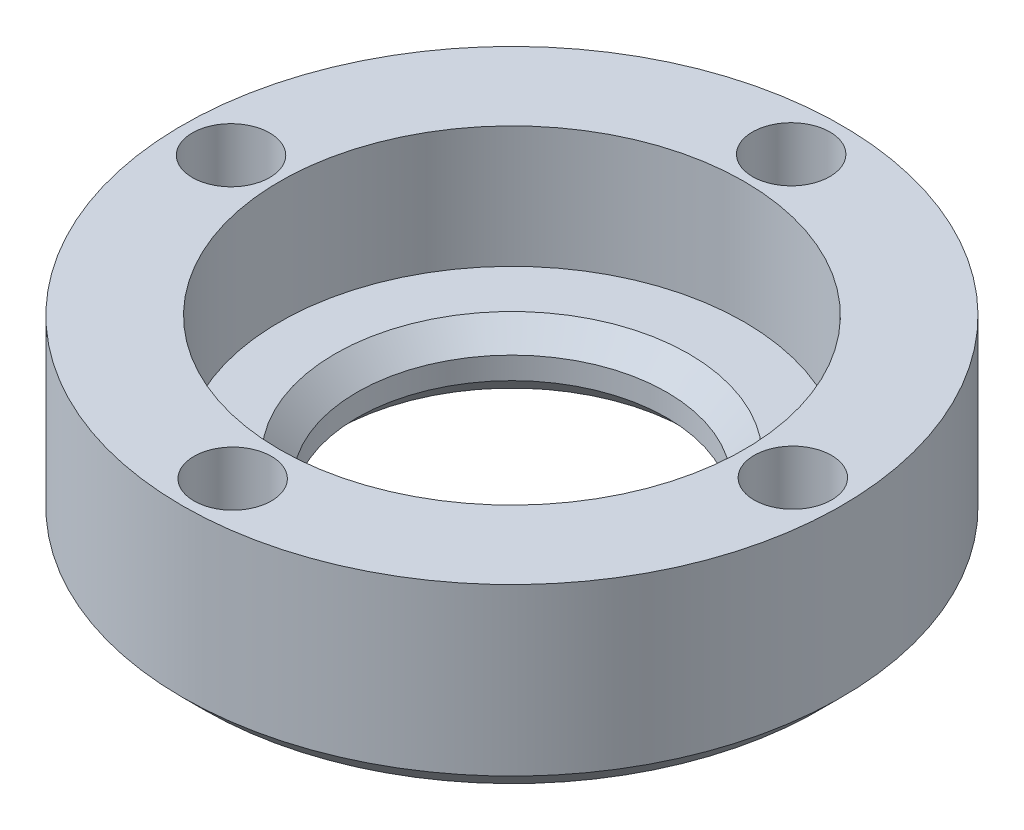
ISO-10303-21;
HEADER;
FILE_DESCRIPTION(('STEP AP214'),'2;1');
FILE_NAME('part.step','',(''),(''),'','','');
FILE_SCHEMA(('AUTOMOTIVE_DESIGN { 1 0 10303 214 1 1 1 1 }'));
ENDSEC;
DATA;
#1=APPLICATION_CONTEXT('core data for automotive mechanical design processes');
#2=APPLICATION_PROTOCOL_DEFINITION('international standard','automotive_design',2000,#1);
#3=PRODUCT_CONTEXT('',#1,'mechanical');
#4=PRODUCT('Part','Part','',(#3));
#5=PRODUCT_RELATED_PRODUCT_CATEGORY('part','',(#4));
#6=PRODUCT_DEFINITION_FORMATION('','',#4);
#7=PRODUCT_DEFINITION_CONTEXT('part definition',#1,'design');
#8=PRODUCT_DEFINITION('design','',#6,#7);
#9=PRODUCT_DEFINITION_SHAPE('','',#8);
#10=(LENGTH_UNIT() NAMED_UNIT(*) SI_UNIT(.MILLI.,.METRE.));
#11=(NAMED_UNIT(*) PLANE_ANGLE_UNIT() SI_UNIT($,.RADIAN.));
#12=(NAMED_UNIT(*) SI_UNIT($,.STERADIAN.) SOLID_ANGLE_UNIT());
#13=UNCERTAINTY_MEASURE_WITH_UNIT(LENGTH_MEASURE(1.E-05),#10,'distance_accuracy_value','');
#14=(GEOMETRIC_REPRESENTATION_CONTEXT(3) GLOBAL_UNCERTAINTY_ASSIGNED_CONTEXT((#13)) GLOBAL_UNIT_ASSIGNED_CONTEXT((#10,
#11,#12)) REPRESENTATION_CONTEXT('',''));
#15=CARTESIAN_POINT('',(0.,0.,0.));
#16=DIRECTION('',(0.,0.,1.));
#17=DIRECTION('',(1.,0.,0.));
#18=AXIS2_PLACEMENT_3D('',#15,#16,#17);
#19=CARTESIAN_POINT('',(0.,3.,0.));
#20=DIRECTION('',(0.,1.,0.));
#21=DIRECTION('',(0.,0.,1.));
#22=AXIS2_PLACEMENT_3D('',#19,#20,#21);
#23=PLANE('',#22);
#24=CARTESIAN_POINT('',(0.,3.,0.));
#25=DIRECTION('',(0.,1.,0.));
#26=DIRECTION('',(0.,0.,1.));
#27=AXIS2_PLACEMENT_3D('',#24,#25,#26);
#28=CIRCLE('',#27,8.);
#29=CARTESIAN_POINT('',(0.,3.,8.));
#30=VERTEX_POINT('',#29);
#31=EDGE_CURVE('E54',#30,#30,#28,.F.);
#32=ORIENTED_EDGE('',*,*,#31,.T.);
#33=EDGE_LOOP('',(#32));
#34=FACE_BOUND('',#33,.T.);
#35=CARTESIAN_POINT('',(0.,3.,0.));
#36=DIRECTION('',(0.,1.,0.));
#37=DIRECTION('',(0.,0.,1.));
#38=AXIS2_PLACEMENT_3D('',#35,#36,#37);
#39=CIRCLE('',#38,10.5);
#40=CARTESIAN_POINT('',(0.,3.,10.5));
#41=VERTEX_POINT('',#40);
#42=EDGE_CURVE('E69',#41,#41,#39,.T.);
#43=ORIENTED_EDGE('',*,*,#42,.T.);
#44=EDGE_LOOP('',(#43));
#45=FACE_BOUND('',#44,.T.);
#46=ADVANCED_FACE('F39',(#34,#45),#23,.T.);
#47=CARTESIAN_POINT('',(0.,3.,0.));
#48=DIRECTION('',(0.,-1.,0.));
#49=DIRECTION('',(0.,0.,-1.));
#50=AXIS2_PLACEMENT_3D('',#47,#48,#49);
#51=CYLINDRICAL_SURFACE('',#50,14.9);
#52=CARTESIAN_POINT('',(0.,1.00000000000001,0.));
#53=DIRECTION('',(0.,1.,0.));
#54=DIRECTION('',(0.,0.,1.));
#55=AXIS2_PLACEMENT_3D('',#52,#53,#54);
#56=CIRCLE('',#55,14.9);
#57=CARTESIAN_POINT('',(0.,1.00000000000001,14.9));
#58=VERTEX_POINT('',#57);
#59=EDGE_CURVE('E51',#58,#58,#56,.T.);
#60=ORIENTED_EDGE('',*,*,#59,.T.);
#61=EDGE_LOOP('',(#60));
#62=FACE_BOUND('',#61,.T.);
#63=CARTESIAN_POINT('',(0.,8.5,0.));
#64=DIRECTION('',(0.,1.,0.));
#65=DIRECTION('',(0.,0.,1.));
#66=AXIS2_PLACEMENT_3D('',#63,#64,#65);
#67=CIRCLE('',#66,14.9);
#68=CARTESIAN_POINT('',(0.,8.5,14.9));
#69=VERTEX_POINT('',#68);
#70=EDGE_CURVE('E73',#69,#69,#67,.T.);
#71=ORIENTED_EDGE('',*,*,#70,.F.);
#72=EDGE_LOOP('',(#71));
#73=FACE_BOUND('',#72,.T.);
#74=ADVANCED_FACE('F125',(#62,#73),#51,.T.);
#75=CARTESIAN_POINT('',(0.,0.,0.));
#76=DIRECTION('',(0.,1.,0.));
#77=DIRECTION('',(0.,0.,1.));
#78=AXIS2_PLACEMENT_3D('',#75,#76,#77);
#79=PLANE('',#78);
#80=CARTESIAN_POINT('',(0.,0.,0.));
#81=DIRECTION('',(0.,1.,0.));
#82=DIRECTION('',(0.,0.,1.));
#83=AXIS2_PLACEMENT_3D('',#80,#81,#82);
#84=CIRCLE('',#83,13.9);
#85=CARTESIAN_POINT('',(0.,0.,13.9));
#86=VERTEX_POINT('',#85);
#87=EDGE_CURVE('E10',#86,#86,#84,.F.);
#88=ORIENTED_EDGE('',*,*,#87,.T.);
#89=EDGE_LOOP('',(#88));
#90=FACE_BOUND('',#89,.T.);
#91=CARTESIAN_POINT('',(0.,0.,0.));
#92=DIRECTION('',(0.,1.,0.));
#93=DIRECTION('',(0.,0.,1.));
#94=AXIS2_PLACEMENT_3D('',#91,#92,#93);
#95=CIRCLE('',#94,8.);
#96=CARTESIAN_POINT('',(0.,0.,8.));
#97=VERTEX_POINT('',#96);
#98=EDGE_CURVE('E50',#97,#97,#95,.T.);
#99=ORIENTED_EDGE('',*,*,#98,.T.);
#100=EDGE_LOOP('',(#99));
#101=FACE_BOUND('',#100,.T.);
#102=ADVANCED_FACE('F126',(#90,#101),#79,.F.);
#103=CARTESIAN_POINT('',(0.,0.,0.));
#104=DIRECTION('',(0.,1.,0.));
#105=DIRECTION('',(0.,0.,1.));
#106=AXIS2_PLACEMENT_3D('',#103,#104,#105);
#107=CYLINDRICAL_SURFACE('',#106,7.);
#108=CARTESIAN_POINT('',(0.,2.00000000000001,0.));
#109=DIRECTION('',(0.,1.,0.));
#110=DIRECTION('',(0.,0.,1.));
#111=AXIS2_PLACEMENT_3D('',#108,#109,#110);
#112=CIRCLE('',#111,7.);
#113=CARTESIAN_POINT('',(0.,2.00000000000001,7.));
#114=VERTEX_POINT('',#113);
#115=EDGE_CURVE('E58',#114,#114,#112,.T.);
#116=ORIENTED_EDGE('',*,*,#115,.T.);
#117=EDGE_LOOP('',(#116));
#118=FACE_BOUND('',#117,.T.);
#119=CARTESIAN_POINT('',(0.,1.00000000000001,0.));
#120=DIRECTION('',(0.,1.,0.));
#121=DIRECTION('',(0.,0.,1.));
#122=AXIS2_PLACEMENT_3D('',#119,#120,#121);
#123=CIRCLE('',#122,7.);
#124=CARTESIAN_POINT('',(0.,1.00000000000001,7.));
#125=VERTEX_POINT('',#124);
#126=EDGE_CURVE('E64',#125,#125,#123,.F.);
#127=ORIENTED_EDGE('',*,*,#126,.T.);
#128=EDGE_LOOP('',(#127));
#129=FACE_BOUND('',#128,.T.);
#130=ADVANCED_FACE('F132',(#118,#129),#107,.F.);
#131=CARTESIAN_POINT('',(0.,6.5,0.));
#132=DIRECTION('',(0.,-1.,0.));
#133=DIRECTION('',(0.,0.,-1.));
#134=AXIS2_PLACEMENT_3D('',#131,#132,#133);
#135=CYLINDRICAL_SURFACE('',#134,10.5);
#136=ORIENTED_EDGE('',*,*,#42,.F.);
#137=EDGE_LOOP('',(#136));
#138=FACE_BOUND('',#137,.T.);
#139=CARTESIAN_POINT('',(0.,8.5,0.));
#140=DIRECTION('',(0.,1.,0.));
#141=DIRECTION('',(0.,0.,1.));
#142=AXIS2_PLACEMENT_3D('',#139,#140,#141);
#143=CIRCLE('',#142,10.5);
#144=CARTESIAN_POINT('',(0.,8.5,10.5));
#145=VERTEX_POINT('',#144);
#146=EDGE_CURVE('E81',#145,#145,#143,.T.);
#147=ORIENTED_EDGE('',*,*,#146,.T.);
#148=EDGE_LOOP('',(#147));
#149=FACE_BOUND('',#148,.T.);
#150=ADVANCED_FACE('F144',(#138,#149),#135,.F.);
#151=CARTESIAN_POINT('',(0.,2.00000000000001,0.));
#152=DIRECTION('',(0.,1.,0.));
#153=DIRECTION('',(0.,0.,1.));
#154=AXIS2_PLACEMENT_3D('',#151,#152,#153);
#155=CONICAL_SURFACE('',#154,7.,0.78539816339745);
#156=ORIENTED_EDGE('',*,*,#31,.F.);
#157=EDGE_LOOP('',(#156));
#158=FACE_BOUND('',#157,.T.);
#159=ORIENTED_EDGE('',*,*,#115,.F.);
#160=EDGE_LOOP('',(#159));
#161=FACE_BOUND('',#160,.T.);
#162=ADVANCED_FACE('F138',(#158,#161),#155,.F.);
#163=CARTESIAN_POINT('',(0.,1.00000000000001,0.));
#164=DIRECTION('',(0.,1.,0.));
#165=DIRECTION('',(0.,0.,1.));
#166=AXIS2_PLACEMENT_3D('',#163,#164,#165);
#167=CONICAL_SURFACE('',#166,14.9,0.785398163397449);
#168=ORIENTED_EDGE('',*,*,#87,.F.);
#169=EDGE_LOOP('',(#168));
#170=FACE_BOUND('',#169,.T.);
#171=ORIENTED_EDGE('',*,*,#59,.F.);
#172=EDGE_LOOP('',(#171));
#173=FACE_BOUND('',#172,.T.);
#174=ADVANCED_FACE('F116',(#170,#173),#167,.T.);
#175=CARTESIAN_POINT('',(0.,0.,0.));
#176=DIRECTION('',(0.,-1.,0.));
#177=DIRECTION('',(0.,0.,-1.));
#178=AXIS2_PLACEMENT_3D('',#175,#176,#177);
#179=CONICAL_SURFACE('',#178,8.,0.785398163397447);
#180=ORIENTED_EDGE('',*,*,#126,.F.);
#181=EDGE_LOOP('',(#180));
#182=FACE_BOUND('',#181,.T.);
#183=ORIENTED_EDGE('',*,*,#98,.F.);
#184=EDGE_LOOP('',(#183));
#185=FACE_BOUND('',#184,.T.);
#186=ADVANCED_FACE('F45',(#182,#185),#179,.F.);
#187=CARTESIAN_POINT('',(0.,8.5,0.));
#188=DIRECTION('',(0.,1.,0.));
#189=DIRECTION('',(0.,0.,1.));
#190=AXIS2_PLACEMENT_3D('',#187,#188,#189);
#191=PLANE('',#190);
#192=CARTESIAN_POINT('',(0.0750000000000005,8.5,12.6999999999999));
#193=DIRECTION('',(0.,1.,0.));
#194=DIRECTION('',(0.,0.,1.));
#195=AXIS2_PLACEMENT_3D('',#192,#193,#194);
#196=CIRCLE('',#195,1.75);
#197=CARTESIAN_POINT('',(0.0750000000000005,8.5,14.4499999999999));
#198=VERTEX_POINT('',#197);
#199=EDGE_CURVE('E95',#198,#198,#196,.T.);
#200=ORIENTED_EDGE('',*,*,#199,.F.);
#201=EDGE_LOOP('',(#200));
#202=FACE_BOUND('',#201,.T.);
#203=CARTESIAN_POINT('',(1.31918385923908E-13,8.5,-12.625));
#204=DIRECTION('',(0.,1.,0.));
#205=DIRECTION('',(0.,0.,1.));
#206=AXIS2_PLACEMENT_3D('',#203,#204,#205);
#207=CIRCLE('',#206,1.75);
#208=CARTESIAN_POINT('',(1.31918385923908E-13,8.5,-10.875));
#209=VERTEX_POINT('',#208);
#210=EDGE_CURVE('E86',#209,#209,#207,.T.);
#211=ORIENTED_EDGE('',*,*,#210,.F.);
#212=EDGE_LOOP('',(#211));
#213=FACE_BOUND('',#212,.T.);
#214=ORIENTED_EDGE('',*,*,#70,.T.);
#215=EDGE_LOOP('',(#214));
#216=FACE_BOUND('',#215,.T.);
#217=ORIENTED_EDGE('',*,*,#146,.F.);
#218=EDGE_LOOP('',(#217));
#219=FACE_BOUND('',#218,.T.);
#220=CARTESIAN_POINT('',(-12.6249999999999,8.5,0.0749999999998712));
#221=DIRECTION('',(0.,1.,0.));
#222=DIRECTION('',(0.,0.,1.));
#223=AXIS2_PLACEMENT_3D('',#220,#221,#222);
#224=CIRCLE('',#223,1.75);
#225=CARTESIAN_POINT('',(-12.6249999999999,8.5,1.82499999999987));
#226=VERTEX_POINT('',#225);
#227=EDGE_CURVE('E87',#226,#226,#224,.T.);
#228=ORIENTED_EDGE('',*,*,#227,.F.);
#229=EDGE_LOOP('',(#228));
#230=FACE_BOUND('',#229,.T.);
#231=CARTESIAN_POINT('',(12.7,8.5,0.));
#232=DIRECTION('',(0.,1.,0.));
#233=DIRECTION('',(0.,0.,1.));
#234=AXIS2_PLACEMENT_3D('',#231,#232,#233);
#235=CIRCLE('',#234,1.75);
#236=CARTESIAN_POINT('',(12.7,8.5,1.75));
#237=VERTEX_POINT('',#236);
#238=EDGE_CURVE('E98',#237,#237,#235,.T.);
#239=ORIENTED_EDGE('',*,*,#238,.F.);
#240=EDGE_LOOP('',(#239));
#241=FACE_BOUND('',#240,.T.);
#242=ADVANCED_FACE('F105',(#202,#213,#216,#219,#230,#241),#191,.T.);
#243=CARTESIAN_POINT('',(1.31918385923908E-13,2.5,-12.625));
#244=DIRECTION('',(0.,1.,0.));
#245=DIRECTION('',(0.,0.,1.));
#246=AXIS2_PLACEMENT_3D('',#243,#244,#245);
#247=PLANE('',#246);
#248=CARTESIAN_POINT('',(1.31918385923908E-13,2.5,-12.625));
#249=DIRECTION('',(0.,1.,0.));
#250=DIRECTION('',(0.,0.,1.));
#251=AXIS2_PLACEMENT_3D('',#248,#249,#250);
#252=CIRCLE('',#251,1.75);
#253=CARTESIAN_POINT('',(1.31918385923908E-13,2.5,-10.875));
#254=VERTEX_POINT('',#253);
#255=EDGE_CURVE('E67',#254,#254,#252,.T.);
#256=ORIENTED_EDGE('',*,*,#255,.T.);
#257=EDGE_LOOP('',(#256));
#258=FACE_BOUND('',#257,.T.);
#259=ADVANCED_FACE('F104',(#258),#247,.T.);
#260=CARTESIAN_POINT('',(1.31918385923908E-13,2.5,-12.625));
#261=DIRECTION('',(0.,1.,0.));
#262=DIRECTION('',(0.,0.,1.));
#263=AXIS2_PLACEMENT_3D('',#260,#261,#262);
#264=CYLINDRICAL_SURFACE('',#263,1.75);
#265=ORIENTED_EDGE('',*,*,#255,.F.);
#266=EDGE_LOOP('',(#265));
#267=FACE_BOUND('',#266,.T.);
#268=ORIENTED_EDGE('',*,*,#210,.T.);
#269=EDGE_LOOP('',(#268));
#270=FACE_BOUND('',#269,.T.);
#271=ADVANCED_FACE('F115',(#267,#270),#264,.F.);
#272=CARTESIAN_POINT('',(-12.6249999999999,2.5,0.0749999999998712));
#273=DIRECTION('',(0.,1.,0.));
#274=DIRECTION('',(0.,0.,1.));
#275=AXIS2_PLACEMENT_3D('',#272,#273,#274);
#276=PLANE('',#275);
#277=CARTESIAN_POINT('',(-12.6249999999999,2.5,0.0749999999998712));
#278=DIRECTION('',(0.,1.,0.));
#279=DIRECTION('',(0.,0.,1.));
#280=AXIS2_PLACEMENT_3D('',#277,#278,#279);
#281=CIRCLE('',#280,1.75);
#282=CARTESIAN_POINT('',(-12.6249999999999,2.5,1.82499999999987));
#283=VERTEX_POINT('',#282);
#284=EDGE_CURVE('E75',#283,#283,#281,.T.);
#285=ORIENTED_EDGE('',*,*,#284,.T.);
#286=EDGE_LOOP('',(#285));
#287=FACE_BOUND('',#286,.T.);
#288=ADVANCED_FACE('F164',(#287),#276,.T.);
#289=CARTESIAN_POINT('',(-12.6249999999999,2.5,0.0749999999998712));
#290=DIRECTION('',(0.,1.,0.));
#291=DIRECTION('',(0.,0.,1.));
#292=AXIS2_PLACEMENT_3D('',#289,#290,#291);
#293=CYLINDRICAL_SURFACE('',#292,1.75);
#294=ORIENTED_EDGE('',*,*,#284,.F.);
#295=EDGE_LOOP('',(#294));
#296=FACE_BOUND('',#295,.T.);
#297=ORIENTED_EDGE('',*,*,#227,.T.);
#298=EDGE_LOOP('',(#297));
#299=FACE_BOUND('',#298,.T.);
#300=ADVANCED_FACE('F162',(#296,#299),#293,.F.);
#301=CARTESIAN_POINT('',(0.0750000000000005,2.5,12.6999999999999));
#302=DIRECTION('',(0.,1.,0.));
#303=DIRECTION('',(0.,0.,1.));
#304=AXIS2_PLACEMENT_3D('',#301,#302,#303);
#305=PLANE('',#304);
#306=CARTESIAN_POINT('',(0.0750000000000005,2.5,12.6999999999999));
#307=DIRECTION('',(0.,1.,0.));
#308=DIRECTION('',(0.,0.,1.));
#309=AXIS2_PLACEMENT_3D('',#306,#307,#308);
#310=CIRCLE('',#309,1.75);
#311=CARTESIAN_POINT('',(0.0750000000000005,2.5,14.4499999999999));
#312=VERTEX_POINT('',#311);
#313=EDGE_CURVE('E80',#312,#312,#310,.T.);
#314=ORIENTED_EDGE('',*,*,#313,.T.);
#315=EDGE_LOOP('',(#314));
#316=FACE_BOUND('',#315,.T.);
#317=ADVANCED_FACE('F165',(#316),#305,.T.);
#318=CARTESIAN_POINT('',(0.0750000000000005,2.5,12.6999999999999));
#319=DIRECTION('',(0.,1.,0.));
#320=DIRECTION('',(0.,0.,1.));
#321=AXIS2_PLACEMENT_3D('',#318,#319,#320);
#322=CYLINDRICAL_SURFACE('',#321,1.75);
#323=ORIENTED_EDGE('',*,*,#313,.F.);
#324=EDGE_LOOP('',(#323));
#325=FACE_BOUND('',#324,.T.);
#326=ORIENTED_EDGE('',*,*,#199,.T.);
#327=EDGE_LOOP('',(#326));
#328=FACE_BOUND('',#327,.T.);
#329=ADVANCED_FACE('F175',(#325,#328),#322,.F.);
#330=CARTESIAN_POINT('',(12.7,2.5,0.));
#331=DIRECTION('',(0.,1.,0.));
#332=DIRECTION('',(0.,0.,1.));
#333=AXIS2_PLACEMENT_3D('',#330,#331,#332);
#334=PLANE('',#333);
#335=CARTESIAN_POINT('',(12.7,2.5,0.));
#336=DIRECTION('',(0.,1.,0.));
#337=DIRECTION('',(0.,0.,1.));
#338=AXIS2_PLACEMENT_3D('',#335,#336,#337);
#339=CIRCLE('',#338,1.75);
#340=CARTESIAN_POINT('',(12.7,2.5,1.75));
#341=VERTEX_POINT('',#340);
#342=EDGE_CURVE('E68',#341,#341,#339,.T.);
#343=ORIENTED_EDGE('',*,*,#342,.T.);
#344=EDGE_LOOP('',(#343));
#345=FACE_BOUND('',#344,.T.);
#346=ADVANCED_FACE('F257',(#345),#334,.T.);
#347=CARTESIAN_POINT('',(12.7,2.5,0.));
#348=DIRECTION('',(0.,1.,0.));
#349=DIRECTION('',(0.,0.,1.));
#350=AXIS2_PLACEMENT_3D('',#347,#348,#349);
#351=CYLINDRICAL_SURFACE('',#350,1.75);
#352=ORIENTED_EDGE('',*,*,#342,.F.);
#353=EDGE_LOOP('',(#352));
#354=FACE_BOUND('',#353,.T.);
#355=ORIENTED_EDGE('',*,*,#238,.T.);
#356=EDGE_LOOP('',(#355));
#357=FACE_BOUND('',#356,.T.);
#358=ADVANCED_FACE('F99',(#354,#357),#351,.F.);
#359=CLOSED_SHELL('',(#46,#74,#102,#130,#150,#162,#174,#186,#242,#259,#271,#288,#300,#317,#329,
#346,#358));
#360=MANIFOLD_SOLID_BREP('B2',#359);
#361=ADVANCED_BREP_SHAPE_REPRESENTATION('',(#18,#360),#14);
#362=SHAPE_DEFINITION_REPRESENTATION(#9,#361);
ENDSEC;
END-ISO-10303-21;
